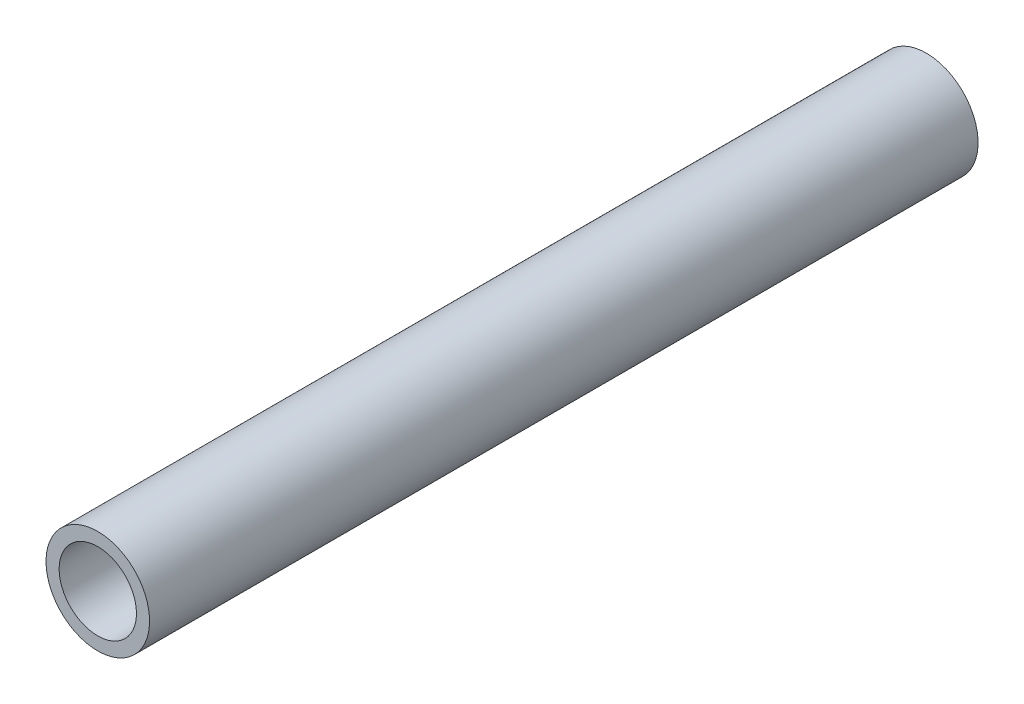
ISO-10303-21;
HEADER;
FILE_DESCRIPTION(('STEP AP214'),'2;1');
FILE_NAME('part.step','',(''),(''),'','','');
FILE_SCHEMA(('AUTOMOTIVE_DESIGN { 1 0 10303 214 1 1 1 1 }'));
ENDSEC;
DATA;
#1=APPLICATION_CONTEXT('core data for automotive mechanical design processes');
#2=APPLICATION_PROTOCOL_DEFINITION('international standard','automotive_design',2000,#1);
#3=PRODUCT_CONTEXT('',#1,'mechanical');
#4=PRODUCT('Part','Part','',(#3));
#5=PRODUCT_RELATED_PRODUCT_CATEGORY('part','',(#4));
#6=PRODUCT_DEFINITION_FORMATION('','',#4);
#7=PRODUCT_DEFINITION_CONTEXT('part definition',#1,'design');
#8=PRODUCT_DEFINITION('design','',#6,#7);
#9=PRODUCT_DEFINITION_SHAPE('','',#8);
#10=(LENGTH_UNIT() NAMED_UNIT(*) SI_UNIT(.MILLI.,.METRE.));
#11=(NAMED_UNIT(*) PLANE_ANGLE_UNIT() SI_UNIT($,.RADIAN.));
#12=(NAMED_UNIT(*) SI_UNIT($,.STERADIAN.) SOLID_ANGLE_UNIT());
#13=UNCERTAINTY_MEASURE_WITH_UNIT(LENGTH_MEASURE(1.E-05),#10,'distance_accuracy_value','');
#14=(GEOMETRIC_REPRESENTATION_CONTEXT(3) GLOBAL_UNCERTAINTY_ASSIGNED_CONTEXT((#13)) GLOBAL_UNIT_ASSIGNED_CONTEXT((#10,
#11,#12)) REPRESENTATION_CONTEXT('',''));
#15=CARTESIAN_POINT('',(0.,0.,0.));
#16=DIRECTION('',(0.,0.,1.));
#17=DIRECTION('',(1.,0.,0.));
#18=AXIS2_PLACEMENT_3D('',#15,#16,#17);
#19=CARTESIAN_POINT('',(0.,0.,152.4));
#20=DIRECTION('',(0.,0.,1.));
#21=DIRECTION('',(1.,0.,0.));
#22=AXIS2_PLACEMENT_3D('',#19,#20,#21);
#23=PLANE('',#22);
#24=CARTESIAN_POINT('',(0.,0.,152.4));
#25=DIRECTION('',(0.,0.,1.));
#26=DIRECTION('',(1.,0.,0.));
#27=AXIS2_PLACEMENT_3D('',#24,#25,#26);
#28=CIRCLE('',#27,9.525);
#29=CARTESIAN_POINT('',(-9.525,0.,152.4));
#30=VERTEX_POINT('',#29);
#31=EDGE_CURVE('E10',#30,#30,#28,.T.);
#32=ORIENTED_EDGE('',*,*,#31,.T.);
#33=EDGE_LOOP('',(#32));
#34=FACE_BOUND('',#33,.T.);
#35=CARTESIAN_POINT('',(0.,0.,152.4));
#36=DIRECTION('',(0.,0.,1.));
#37=DIRECTION('',(1.,0.,0.));
#38=AXIS2_PLACEMENT_3D('',#35,#36,#37);
#39=CIRCLE('',#38,7.112);
#40=CARTESIAN_POINT('',(-7.112,0.,152.4));
#41=VERTEX_POINT('',#40);
#42=EDGE_CURVE('E42',#41,#41,#39,.T.);
#43=ORIENTED_EDGE('',*,*,#42,.F.);
#44=EDGE_LOOP('',(#43));
#45=FACE_BOUND('',#44,.T.);
#46=ADVANCED_FACE('F31',(#34,#45),#23,.T.);
#47=CARTESIAN_POINT('',(0.,0.,0.));
#48=DIRECTION('',(0.,0.,1.));
#49=DIRECTION('',(1.,0.,0.));
#50=AXIS2_PLACEMENT_3D('',#47,#48,#49);
#51=PLANE('',#50);
#52=CARTESIAN_POINT('',(0.,0.,0.));
#53=DIRECTION('',(0.,0.,1.));
#54=DIRECTION('',(1.,0.,0.));
#55=AXIS2_PLACEMENT_3D('',#52,#53,#54);
#56=CIRCLE('',#55,9.525);
#57=CARTESIAN_POINT('',(-9.525,0.,0.));
#58=VERTEX_POINT('',#57);
#59=EDGE_CURVE('E35',#58,#58,#56,.T.);
#60=ORIENTED_EDGE('',*,*,#59,.F.);
#61=EDGE_LOOP('',(#60));
#62=FACE_BOUND('',#61,.T.);
#63=CARTESIAN_POINT('',(0.,0.,0.));
#64=DIRECTION('',(0.,0.,1.));
#65=DIRECTION('',(1.,0.,0.));
#66=AXIS2_PLACEMENT_3D('',#63,#64,#65);
#67=CIRCLE('',#66,7.112);
#68=CARTESIAN_POINT('',(-7.112,0.,0.));
#69=VERTEX_POINT('',#68);
#70=EDGE_CURVE('E44',#69,#69,#67,.T.);
#71=ORIENTED_EDGE('',*,*,#70,.T.);
#72=EDGE_LOOP('',(#71));
#73=FACE_BOUND('',#72,.T.);
#74=ADVANCED_FACE('F54',(#62,#73),#51,.F.);
#75=CARTESIAN_POINT('',(0.,0.,152.4));
#76=DIRECTION('',(0.,0.,-1.));
#77=DIRECTION('',(-1.,0.,0.));
#78=AXIS2_PLACEMENT_3D('',#75,#76,#77);
#79=CYLINDRICAL_SURFACE('',#78,9.525);
#80=CARTESIAN_POINT('',(-9.525,0.,152.4));
#81=CARTESIAN_POINT('',(-9.525,0.,150.8125));
#82=CARTESIAN_POINT('',(-9.525,0.,149.225));
#83=CARTESIAN_POINT('',(-9.525,0.,146.05));
#84=CARTESIAN_POINT('',(-9.525,0.,144.4625));
#85=CARTESIAN_POINT('',(-9.525,0.,141.2875));
#86=CARTESIAN_POINT('',(-9.525,0.,139.7));
#87=CARTESIAN_POINT('',(-9.525,0.,136.525));
#88=CARTESIAN_POINT('',(-9.525,0.,134.9375));
#89=CARTESIAN_POINT('',(-9.525,0.,131.7625));
#90=CARTESIAN_POINT('',(-9.525,0.,130.175));
#91=CARTESIAN_POINT('',(-9.525,0.,127.));
#92=CARTESIAN_POINT('',(-9.525,0.,125.4125));
#93=CARTESIAN_POINT('',(-9.525,0.,122.2375));
#94=CARTESIAN_POINT('',(-9.525,0.,120.65));
#95=CARTESIAN_POINT('',(-9.525,0.,117.475));
#96=CARTESIAN_POINT('',(-9.525,0.,115.8875));
#97=CARTESIAN_POINT('',(-9.525,0.,112.7125));
#98=CARTESIAN_POINT('',(-9.525,0.,111.125));
#99=CARTESIAN_POINT('',(-9.525,0.,107.95));
#100=CARTESIAN_POINT('',(-9.525,0.,106.3625));
#101=CARTESIAN_POINT('',(-9.525,0.,103.1875));
#102=CARTESIAN_POINT('',(-9.525,0.,101.6));
#103=CARTESIAN_POINT('',(-9.525,0.,98.425));
#104=CARTESIAN_POINT('',(-9.525,0.,96.8375));
#105=CARTESIAN_POINT('',(-9.525,0.,93.6625));
#106=CARTESIAN_POINT('',(-9.525,0.,92.075));
#107=CARTESIAN_POINT('',(-9.525,0.,88.9));
#108=CARTESIAN_POINT('',(-9.525,0.,87.3125));
#109=CARTESIAN_POINT('',(-9.525,0.,84.1375));
#110=CARTESIAN_POINT('',(-9.525,0.,82.55));
#111=CARTESIAN_POINT('',(-9.525,0.,79.375));
#112=CARTESIAN_POINT('',(-9.525,0.,77.7875));
#113=CARTESIAN_POINT('',(-9.525,0.,74.6125));
#114=CARTESIAN_POINT('',(-9.525,0.,73.025));
#115=CARTESIAN_POINT('',(-9.525,0.,69.85));
#116=CARTESIAN_POINT('',(-9.525,0.,68.2625));
#117=CARTESIAN_POINT('',(-9.525,0.,65.0875));
#118=CARTESIAN_POINT('',(-9.525,0.,63.5));
#119=CARTESIAN_POINT('',(-9.525,0.,60.325));
#120=CARTESIAN_POINT('',(-9.525,0.,58.7375));
#121=CARTESIAN_POINT('',(-9.525,0.,55.5625));
#122=CARTESIAN_POINT('',(-9.525,0.,53.975));
#123=CARTESIAN_POINT('',(-9.525,0.,50.8));
#124=CARTESIAN_POINT('',(-9.525,0.,49.2125));
#125=CARTESIAN_POINT('',(-9.525,0.,46.0375));
#126=CARTESIAN_POINT('',(-9.525,0.,44.45));
#127=CARTESIAN_POINT('',(-9.525,0.,41.275));
#128=CARTESIAN_POINT('',(-9.525,0.,39.6875));
#129=CARTESIAN_POINT('',(-9.525,0.,36.5125));
#130=CARTESIAN_POINT('',(-9.525,0.,34.925));
#131=CARTESIAN_POINT('',(-9.525,0.,31.75));
#132=CARTESIAN_POINT('',(-9.525,0.,30.1625));
#133=CARTESIAN_POINT('',(-9.525,0.,26.9875));
#134=CARTESIAN_POINT('',(-9.525,0.,25.4));
#135=CARTESIAN_POINT('',(-9.525,0.,22.225));
#136=CARTESIAN_POINT('',(-9.525,0.,20.6375));
#137=CARTESIAN_POINT('',(-9.525,0.,17.4625));
#138=CARTESIAN_POINT('',(-9.525,0.,15.875));
#139=CARTESIAN_POINT('',(-9.525,0.,12.7));
#140=CARTESIAN_POINT('',(-9.525,0.,11.1125));
#141=CARTESIAN_POINT('',(-9.525,0.,7.93750000000001));
#142=CARTESIAN_POINT('',(-9.525,0.,6.35));
#143=CARTESIAN_POINT('',(-9.525,0.,3.175));
#144=CARTESIAN_POINT('',(-9.525,0.,1.5875));
#145=CARTESIAN_POINT('',(-9.525,0.,0.));
#146=B_SPLINE_CURVE_WITH_KNOTS('',3,(#80,#81,#82,#83,#84,#85,#86,#87,#88,#89,#90,#91,#92,#93,
#94,#95,#96,#97,#98,#99,#100,#101,#102,#103,#104,#105,#106,#107,#108,#109,#110,#111,#112,#113,
#114,#115,#116,#117,#118,#119,#120,#121,#122,#123,#124,#125,#126,#127,#128,#129,#130,#131,#132,
#133,#134,#135,#136,#137,#138,#139,#140,#141,#142,#143,#144,#145),.UNSPECIFIED.,.F.,.F.,(4,2,2,
2,2,2,2,2,2,2,2,2,2,2,2,2,2,2,2,2,2,2,2,2,2,2,2,2,2,2,2,2,4),(0.,4.7625,9.52500000000001,
14.2875,19.05,23.8125,28.575,33.3375,38.1,42.8625,47.625,52.3875,57.15,61.9125,66.675,71.4375,
76.2,80.9625,85.725,90.4875,95.25,100.0125,104.775,109.5375,114.3,119.0625,123.825,128.5875,
133.35,138.1125,142.875,147.6375,152.4),.UNSPECIFIED.);
#147=EDGE_CURVE('BSEAM33',#30,#58,#146,.T.);
#148=ORIENTED_EDGE('',*,*,#31,.F.);
#149=ORIENTED_EDGE('',*,*,#59,.T.);
#150=ORIENTED_EDGE('',*,*,#147,.T.);
#151=ORIENTED_EDGE('',*,*,#147,.F.);
#152=EDGE_LOOP('',(#148,#150,#149,#151));
#153=FACE_BOUND('',#152,.T.);
#154=ADVANCED_FACE('F33',(#153),#79,.T.);
#155=CARTESIAN_POINT('',(0.,0.,152.4));
#156=DIRECTION('',(0.,0.,-1.));
#157=DIRECTION('',(-1.,0.,0.));
#158=AXIS2_PLACEMENT_3D('',#155,#156,#157);
#159=CYLINDRICAL_SURFACE('',#158,7.112);
#160=CARTESIAN_POINT('',(-7.112,0.,152.4));
#161=CARTESIAN_POINT('',(-7.112,0.,150.8125));
#162=CARTESIAN_POINT('',(-7.112,0.,149.225));
#163=CARTESIAN_POINT('',(-7.112,0.,146.05));
#164=CARTESIAN_POINT('',(-7.112,0.,144.4625));
#165=CARTESIAN_POINT('',(-7.112,0.,141.2875));
#166=CARTESIAN_POINT('',(-7.112,0.,139.7));
#167=CARTESIAN_POINT('',(-7.112,0.,136.525));
#168=CARTESIAN_POINT('',(-7.112,0.,134.9375));
#169=CARTESIAN_POINT('',(-7.112,0.,131.7625));
#170=CARTESIAN_POINT('',(-7.112,0.,130.175));
#171=CARTESIAN_POINT('',(-7.112,0.,127.));
#172=CARTESIAN_POINT('',(-7.112,0.,125.4125));
#173=CARTESIAN_POINT('',(-7.112,0.,122.2375));
#174=CARTESIAN_POINT('',(-7.112,0.,120.65));
#175=CARTESIAN_POINT('',(-7.112,0.,117.475));
#176=CARTESIAN_POINT('',(-7.112,0.,115.8875));
#177=CARTESIAN_POINT('',(-7.112,0.,112.7125));
#178=CARTESIAN_POINT('',(-7.112,0.,111.125));
#179=CARTESIAN_POINT('',(-7.112,0.,107.95));
#180=CARTESIAN_POINT('',(-7.112,0.,106.3625));
#181=CARTESIAN_POINT('',(-7.112,0.,103.1875));
#182=CARTESIAN_POINT('',(-7.112,0.,101.6));
#183=CARTESIAN_POINT('',(-7.112,0.,98.425));
#184=CARTESIAN_POINT('',(-7.112,0.,96.8375));
#185=CARTESIAN_POINT('',(-7.112,0.,93.6625));
#186=CARTESIAN_POINT('',(-7.112,0.,92.075));
#187=CARTESIAN_POINT('',(-7.112,0.,88.9));
#188=CARTESIAN_POINT('',(-7.112,0.,87.3125));
#189=CARTESIAN_POINT('',(-7.112,0.,84.1375));
#190=CARTESIAN_POINT('',(-7.112,0.,82.55));
#191=CARTESIAN_POINT('',(-7.112,0.,79.375));
#192=CARTESIAN_POINT('',(-7.112,0.,77.7875));
#193=CARTESIAN_POINT('',(-7.112,0.,74.6125));
#194=CARTESIAN_POINT('',(-7.112,0.,73.025));
#195=CARTESIAN_POINT('',(-7.112,0.,69.85));
#196=CARTESIAN_POINT('',(-7.112,0.,68.2625));
#197=CARTESIAN_POINT('',(-7.112,0.,65.0875));
#198=CARTESIAN_POINT('',(-7.112,0.,63.5));
#199=CARTESIAN_POINT('',(-7.112,0.,60.325));
#200=CARTESIAN_POINT('',(-7.112,0.,58.7375));
#201=CARTESIAN_POINT('',(-7.112,0.,55.5625));
#202=CARTESIAN_POINT('',(-7.112,0.,53.975));
#203=CARTESIAN_POINT('',(-7.112,0.,50.8));
#204=CARTESIAN_POINT('',(-7.112,0.,49.2125));
#205=CARTESIAN_POINT('',(-7.112,0.,46.0375));
#206=CARTESIAN_POINT('',(-7.112,0.,44.45));
#207=CARTESIAN_POINT('',(-7.112,0.,41.275));
#208=CARTESIAN_POINT('',(-7.112,0.,39.6875));
#209=CARTESIAN_POINT('',(-7.112,0.,36.5125));
#210=CARTESIAN_POINT('',(-7.112,0.,34.925));
#211=CARTESIAN_POINT('',(-7.112,0.,31.75));
#212=CARTESIAN_POINT('',(-7.112,0.,30.1625));
#213=CARTESIAN_POINT('',(-7.112,0.,26.9875));
#214=CARTESIAN_POINT('',(-7.112,0.,25.4));
#215=CARTESIAN_POINT('',(-7.112,0.,22.225));
#216=CARTESIAN_POINT('',(-7.112,0.,20.6375));
#217=CARTESIAN_POINT('',(-7.112,0.,17.4625));
#218=CARTESIAN_POINT('',(-7.112,0.,15.875));
#219=CARTESIAN_POINT('',(-7.112,0.,12.7));
#220=CARTESIAN_POINT('',(-7.112,0.,11.1125));
#221=CARTESIAN_POINT('',(-7.112,0.,7.93750000000001));
#222=CARTESIAN_POINT('',(-7.112,0.,6.35));
#223=CARTESIAN_POINT('',(-7.112,0.,3.175));
#224=CARTESIAN_POINT('',(-7.112,0.,1.5875));
#225=CARTESIAN_POINT('',(-7.112,0.,0.));
#226=B_SPLINE_CURVE_WITH_KNOTS('',3,(#160,#161,#162,#163,#164,#165,#166,#167,#168,#169,#170,
#171,#172,#173,#174,#175,#176,#177,#178,#179,#180,#181,#182,#183,#184,#185,#186,#187,#188,#189,
#190,#191,#192,#193,#194,#195,#196,#197,#198,#199,#200,#201,#202,#203,#204,#205,#206,#207,#208,
#209,#210,#211,#212,#213,#214,#215,#216,#217,#218,#219,#220,#221,#222,#223,#224,#225),
.UNSPECIFIED.,.F.,.F.,(4,2,2,2,2,2,2,2,2,2,2,2,2,2,2,2,2,2,2,2,2,2,2,2,2,2,2,2,2,2,2,2,4),(0.,
4.7625,9.52500000000001,14.2875,19.05,23.8125,28.575,33.3375,38.1,42.8625,47.625,52.3875,57.15,
61.9125,66.675,71.4375,76.2,80.9625,85.725,90.4875,95.25,100.0125,104.775,109.5375,114.3,
119.0625,123.825,128.5875,133.35,138.1125,142.875,147.6375,152.4),.UNSPECIFIED.);
#227=EDGE_CURVE('BSEAM50',#41,#69,#226,.T.);
#228=ORIENTED_EDGE('',*,*,#42,.T.);
#229=ORIENTED_EDGE('',*,*,#70,.F.);
#230=ORIENTED_EDGE('',*,*,#227,.T.);
#231=ORIENTED_EDGE('',*,*,#227,.F.);
#232=EDGE_LOOP('',(#228,#230,#229,#231));
#233=FACE_BOUND('',#232,.T.);
#234=ADVANCED_FACE('F50',(#233),#159,.F.);
#235=CLOSED_SHELL('',(#46,#74,#154,#234));
#236=MANIFOLD_SOLID_BREP('B2',#235);
#237=ADVANCED_BREP_SHAPE_REPRESENTATION('',(#18,#236),#14);
#238=SHAPE_DEFINITION_REPRESENTATION(#9,#237);
ENDSEC;
END-ISO-10303-21;
